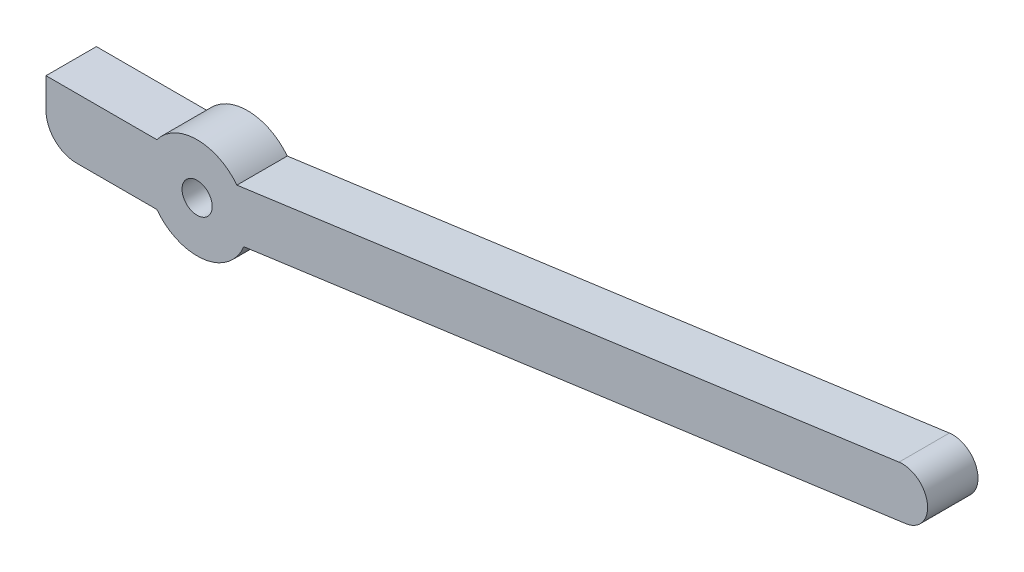
ISO-10303-21;
HEADER;
FILE_DESCRIPTION(('STEP AP214'),'2;1');
FILE_NAME('part.step','',(''),(''),'','','');
FILE_SCHEMA(('AUTOMOTIVE_DESIGN { 1 0 10303 214 1 1 1 1 }'));
ENDSEC;
DATA;
#1=APPLICATION_CONTEXT('core data for automotive mechanical design processes');
#2=APPLICATION_PROTOCOL_DEFINITION('international standard','automotive_design',2000,#1);
#3=PRODUCT_CONTEXT('',#1,'mechanical');
#4=PRODUCT('Part','Part','',(#3));
#5=PRODUCT_RELATED_PRODUCT_CATEGORY('part','',(#4));
#6=PRODUCT_DEFINITION_FORMATION('','',#4);
#7=PRODUCT_DEFINITION_CONTEXT('part definition',#1,'design');
#8=PRODUCT_DEFINITION('design','',#6,#7);
#9=PRODUCT_DEFINITION_SHAPE('','',#8);
#10=(LENGTH_UNIT() NAMED_UNIT(*) SI_UNIT(.MILLI.,.METRE.));
#11=(NAMED_UNIT(*) PLANE_ANGLE_UNIT() SI_UNIT($,.RADIAN.));
#12=(NAMED_UNIT(*) SI_UNIT($,.STERADIAN.) SOLID_ANGLE_UNIT());
#13=UNCERTAINTY_MEASURE_WITH_UNIT(LENGTH_MEASURE(1.E-05),#10,'distance_accuracy_value','');
#14=(GEOMETRIC_REPRESENTATION_CONTEXT(3) GLOBAL_UNCERTAINTY_ASSIGNED_CONTEXT((#13)) GLOBAL_UNIT_ASSIGNED_CONTEXT((#10,
#11,#12)) REPRESENTATION_CONTEXT('',''));
#15=CARTESIAN_POINT('',(0.,0.,0.));
#16=DIRECTION('',(0.,0.,1.));
#17=DIRECTION('',(1.,0.,0.));
#18=AXIS2_PLACEMENT_3D('',#15,#16,#17);
#19=CARTESIAN_POINT('',(-0.5,0.,5.));
#20=DIRECTION('',(0.,0.,-1.));
#21=DIRECTION('',(-1.,0.,0.));
#22=AXIS2_PLACEMENT_3D('',#19,#20,#21);
#23=CYLINDRICAL_SURFACE('',#22,5.);
#24=DIRECTION('',(0.,0.,1.));
#25=VECTOR('',#24,1.);
#26=CARTESIAN_POINT('',(3.4487021157377,3.06720582960593,0.));
#27=LINE('',#26,#25);
#28=CARTESIAN_POINT('',(3.4487021157377,3.06720582960593,0.));
#29=VERTEX_POINT('',#28);
#30=CARTESIAN_POINT('',(3.4487021157377,3.06720582960593,5.));
#31=VERTEX_POINT('',#30);
#32=EDGE_CURVE('E140',#29,#31,#27,.T.);
#33=ORIENTED_EDGE('',*,*,#32,.F.);
#34=CARTESIAN_POINT('',(-0.5,0.,0.));
#35=DIRECTION('',(0.,0.,1.));
#36=DIRECTION('',(1.,0.,0.));
#37=AXIS2_PLACEMENT_3D('',#34,#35,#36);
#38=CIRCLE('',#37,5.);
#39=CARTESIAN_POINT('',(-4.5,3.,0.));
#40=VERTEX_POINT('',#39);
#41=EDGE_CURVE('E161',#40,#29,#38,.F.);
#42=ORIENTED_EDGE('',*,*,#41,.F.);
#43=DIRECTION('',(0.,0.,-1.));
#44=VECTOR('',#43,1.);
#45=CARTESIAN_POINT('',(-4.5,3.,5.));
#46=LINE('',#45,#44);
#47=CARTESIAN_POINT('',(-4.5,3.,5.));
#48=VERTEX_POINT('',#47);
#49=EDGE_CURVE('E177',#48,#40,#46,.T.);
#50=ORIENTED_EDGE('',*,*,#49,.F.);
#51=CARTESIAN_POINT('',(-0.5,0.,5.));
#52=DIRECTION('',(0.,0.,1.));
#53=DIRECTION('',(1.,0.,0.));
#54=AXIS2_PLACEMENT_3D('',#51,#52,#53);
#55=CIRCLE('',#54,5.);
#56=EDGE_CURVE('E145',#48,#31,#55,.F.);
#57=ORIENTED_EDGE('',*,*,#56,.T.);
#58=EDGE_LOOP('',(#33,#42,#50,#57));
#59=FACE_BOUND('',#58,.T.);
#60=ADVANCED_FACE('F39',(#59),#23,.T.);
#61=DIRECTION('',(0.,0.,1.));
#62=VECTOR('',#61,1.);
#63=CARTESIAN_POINT('',(4.13062922494331,-1.88607342940325,0.));
#64=LINE('',#63,#62);
#65=CARTESIAN_POINT('',(4.13062922494331,-1.88607342940325,0.));
#66=VERTEX_POINT('',#65);
#67=CARTESIAN_POINT('',(4.13062922494331,-1.88607342940325,5.));
#68=VERTEX_POINT('',#67);
#69=EDGE_CURVE('E120',#66,#68,#64,.T.);
#70=ORIENTED_EDGE('',*,*,#69,.T.);
#71=CARTESIAN_POINT('',(-4.5,-3.,5.));
#72=VERTEX_POINT('',#71);
#73=EDGE_CURVE('E149',#68,#72,#55,.F.);
#74=ORIENTED_EDGE('',*,*,#73,.T.);
#75=DIRECTION('',(0.,0.,-1.));
#76=VECTOR('',#75,1.);
#77=CARTESIAN_POINT('',(-4.5,-3.,5.));
#78=LINE('',#77,#76);
#79=CARTESIAN_POINT('',(-4.5,-3.,0.));
#80=VERTEX_POINT('',#79);
#81=EDGE_CURVE('E160',#72,#80,#78,.T.);
#82=ORIENTED_EDGE('',*,*,#81,.T.);
#83=EDGE_CURVE('E142',#66,#80,#38,.F.);
#84=ORIENTED_EDGE('',*,*,#83,.F.);
#85=EDGE_LOOP('',(#70,#74,#82,#84));
#86=FACE_BOUND('',#85,.T.);
#87=ADVANCED_FACE('F200',(#86),#23,.T.);
#88=CARTESIAN_POINT('',(0.,3.,5.));
#89=DIRECTION('',(0.,1.,0.));
#90=DIRECTION('',(0.,0.,1.));
#91=AXIS2_PLACEMENT_3D('',#88,#89,#90);
#92=PLANE('',#91);
#93=DIRECTION('',(1.,0.,0.));
#94=VECTOR('',#93,1.);
#95=CARTESIAN_POINT('',(0.,3.,0.));
#96=LINE('',#95,#94);
#97=CARTESIAN_POINT('',(-15.5,3.,0.));
#98=VERTEX_POINT('',#97);
#99=EDGE_CURVE('E163',#98,#40,#96,.T.);
#100=ORIENTED_EDGE('',*,*,#99,.F.);
#101=DIRECTION('',(0.,0.,-1.));
#102=VECTOR('',#101,1.);
#103=CARTESIAN_POINT('',(-15.5,3.,5.));
#104=LINE('',#103,#102);
#105=CARTESIAN_POINT('',(-15.5,3.,5.));
#106=VERTEX_POINT('',#105);
#107=EDGE_CURVE('E175',#106,#98,#104,.T.);
#108=ORIENTED_EDGE('',*,*,#107,.F.);
#109=DIRECTION('',(1.,0.,0.));
#110=VECTOR('',#109,1.);
#111=CARTESIAN_POINT('',(0.,3.,5.));
#112=LINE('',#111,#110);
#113=EDGE_CURVE('E148',#106,#48,#112,.T.);
#114=ORIENTED_EDGE('',*,*,#113,.T.);
#115=ORIENTED_EDGE('',*,*,#49,.T.);
#116=EDGE_LOOP('',(#100,#108,#114,#115));
#117=FACE_BOUND('',#116,.T.);
#118=ADVANCED_FACE('F209',(#117),#92,.T.);
#119=CARTESIAN_POINT('',(-15.5,0.,5.));
#120=DIRECTION('',(1.,0.,0.));
#121=DIRECTION('',(0.,0.,-1.));
#122=AXIS2_PLACEMENT_3D('',#119,#120,#121);
#123=PLANE('',#122);
#124=DIRECTION('',(0.,-1.,0.));
#125=VECTOR('',#124,1.);
#126=CARTESIAN_POINT('',(-15.5,0.,0.));
#127=LINE('',#126,#125);
#128=CARTESIAN_POINT('',(-15.5,0.,0.));
#129=VERTEX_POINT('',#128);
#130=EDGE_CURVE('E166',#98,#129,#127,.T.);
#131=ORIENTED_EDGE('',*,*,#130,.T.);
#132=DIRECTION('',(0.,0.,-1.));
#133=VECTOR('',#132,1.);
#134=CARTESIAN_POINT('',(-15.5,0.,5.));
#135=LINE('',#134,#133);
#136=CARTESIAN_POINT('',(-15.5,0.,5.));
#137=VERTEX_POINT('',#136);
#138=EDGE_CURVE('E47',#129,#137,#135,.F.);
#139=ORIENTED_EDGE('',*,*,#138,.T.);
#140=DIRECTION('',(0.,-1.,0.));
#141=VECTOR('',#140,1.);
#142=CARTESIAN_POINT('',(-15.5,0.,5.));
#143=LINE('',#142,#141);
#144=EDGE_CURVE('E152',#106,#137,#143,.T.);
#145=ORIENTED_EDGE('',*,*,#144,.F.);
#146=ORIENTED_EDGE('',*,*,#107,.T.);
#147=EDGE_LOOP('',(#131,#139,#145,#146));
#148=FACE_BOUND('',#147,.T.);
#149=ADVANCED_FACE('F188',(#148),#123,.F.);
#150=CARTESIAN_POINT('',(0.,-3.,5.));
#151=DIRECTION('',(0.,-1.,0.));
#152=DIRECTION('',(1.,0.,0.));
#153=AXIS2_PLACEMENT_3D('',#150,#151,#152);
#154=PLANE('',#153);
#155=DIRECTION('',(-1.,0.,0.));
#156=VECTOR('',#155,1.);
#157=CARTESIAN_POINT('',(0.,-3.,5.));
#158=LINE('',#157,#156);
#159=CARTESIAN_POINT('',(-12.5,-3.,5.));
#160=VERTEX_POINT('',#159);
#161=EDGE_CURVE('E154',#72,#160,#158,.T.);
#162=ORIENTED_EDGE('',*,*,#161,.T.);
#163=DIRECTION('',(0.,0.,-1.));
#164=VECTOR('',#163,1.);
#165=CARTESIAN_POINT('',(-12.5,-3.,0.));
#166=LINE('',#165,#164);
#167=CARTESIAN_POINT('',(-12.5,-3.,0.));
#168=VERTEX_POINT('',#167);
#169=EDGE_CURVE('E179',#160,#168,#166,.T.);
#170=ORIENTED_EDGE('',*,*,#169,.T.);
#171=DIRECTION('',(-1.,0.,0.));
#172=VECTOR('',#171,1.);
#173=CARTESIAN_POINT('',(0.,-3.,0.));
#174=LINE('',#173,#172);
#175=EDGE_CURVE('E168',#80,#168,#174,.T.);
#176=ORIENTED_EDGE('',*,*,#175,.F.);
#177=ORIENTED_EDGE('',*,*,#81,.F.);
#178=EDGE_LOOP('',(#162,#170,#176,#177));
#179=FACE_BOUND('',#178,.T.);
#180=ADVANCED_FACE('F198',(#179),#154,.T.);
#181=CARTESIAN_POINT('',(-0.5,0.,5.));
#182=DIRECTION('',(0.,0.,-1.));
#183=DIRECTION('',(-1.,0.,0.));
#184=AXIS2_PLACEMENT_3D('',#181,#182,#183);
#185=CYLINDRICAL_SURFACE('',#184,1.5);
#186=CARTESIAN_POINT('',(-0.5,0.,5.));
#187=DIRECTION('',(0.,0.,1.));
#188=DIRECTION('',(1.,0.,0.));
#189=AXIS2_PLACEMENT_3D('',#186,#187,#188);
#190=CIRCLE('',#189,1.5);
#191=CARTESIAN_POINT('',(1.,0.,5.));
#192=VERTEX_POINT('',#191);
#193=EDGE_CURVE('E157',#192,#192,#190,.T.);
#194=ORIENTED_EDGE('',*,*,#193,.T.);
#195=EDGE_LOOP('',(#194));
#196=FACE_BOUND('',#195,.T.);
#197=CARTESIAN_POINT('',(-0.5,0.,0.));
#198=DIRECTION('',(0.,0.,1.));
#199=DIRECTION('',(1.,0.,0.));
#200=AXIS2_PLACEMENT_3D('',#197,#198,#199);
#201=CIRCLE('',#200,1.5);
#202=CARTESIAN_POINT('',(1.,0.,0.));
#203=VERTEX_POINT('',#202);
#204=EDGE_CURVE('E170',#203,#203,#201,.T.);
#205=ORIENTED_EDGE('',*,*,#204,.F.);
#206=EDGE_LOOP('',(#205));
#207=FACE_BOUND('',#206,.T.);
#208=ADVANCED_FACE('F236',(#196,#207),#185,.F.);
#209=CARTESIAN_POINT('',(0.,0.,5.));
#210=DIRECTION('',(0.,0.,1.));
#211=DIRECTION('',(1.,0.,0.));
#212=AXIS2_PLACEMENT_3D('',#209,#210,#211);
#213=PLANE('',#212);
#214=ORIENTED_EDGE('',*,*,#144,.T.);
#215=CARTESIAN_POINT('',(-12.5,0.,5.));
#216=DIRECTION('',(0.,0.,1.));
#217=DIRECTION('',(1.,0.,0.));
#218=AXIS2_PLACEMENT_3D('',#215,#216,#217);
#219=CIRCLE('',#218,3.);
#220=EDGE_CURVE('E11',#137,#160,#219,.T.);
#221=ORIENTED_EDGE('',*,*,#220,.T.);
#222=ORIENTED_EDGE('',*,*,#161,.F.);
#223=ORIENTED_EDGE('',*,*,#73,.F.);
#224=DIRECTION('',(0.990655851801835,0.136385421841122,0.));
#225=VECTOR('',#224,1.);
#226=CARTESIAN_POINT('',(4.13062922494331,-1.88607342940325,5.));
#227=LINE('',#226,#225);
#228=CARTESIAN_POINT('',(69.8409635546028,7.16038972989826,5.));
#229=VERTEX_POINT('',#228);
#230=EDGE_CURVE('E137',#68,#229,#227,.T.);
#231=ORIENTED_EDGE('',*,*,#230,.T.);
#232=CARTESIAN_POINT('',(69.5,9.63702935940285,5.));
#233=DIRECTION('',(0.,0.,1.));
#234=DIRECTION('',(1.,0.,0.));
#235=AXIS2_PLACEMENT_3D('',#232,#233,#234);
#236=CIRCLE('',#235,2.5);
#237=CARTESIAN_POINT('',(69.1590364453972,12.1136689889074,5.));
#238=VERTEX_POINT('',#237);
#239=EDGE_CURVE('E116',#229,#238,#236,.T.);
#240=ORIENTED_EDGE('',*,*,#239,.T.);
#241=DIRECTION('',(-0.990655851801835,-0.136385421841122,0.));
#242=VECTOR('',#241,1.);
#243=CARTESIAN_POINT('',(3.4487021157377,3.06720582960593,5.));
#244=LINE('',#243,#242);
#245=EDGE_CURVE('E131',#238,#31,#244,.T.);
#246=ORIENTED_EDGE('',*,*,#245,.T.);
#247=ORIENTED_EDGE('',*,*,#56,.F.);
#248=ORIENTED_EDGE('',*,*,#113,.F.);
#249=EDGE_LOOP('',(#214,#221,#222,#223,#231,#240,#246,#247,#248));
#250=FACE_BOUND('',#249,.T.);
#251=ORIENTED_EDGE('',*,*,#193,.F.);
#252=EDGE_LOOP('',(#251));
#253=FACE_BOUND('',#252,.T.);
#254=ADVANCED_FACE('F192',(#250,#253),#213,.T.);
#255=CARTESIAN_POINT('',(0.,0.,0.));
#256=DIRECTION('',(0.,0.,1.));
#257=DIRECTION('',(1.,0.,0.));
#258=AXIS2_PLACEMENT_3D('',#255,#256,#257);
#259=PLANE('',#258);
#260=ORIENTED_EDGE('',*,*,#175,.T.);
#261=CARTESIAN_POINT('',(-12.5,0.,0.));
#262=DIRECTION('',(0.,0.,1.));
#263=DIRECTION('',(1.,0.,0.));
#264=AXIS2_PLACEMENT_3D('',#261,#262,#263);
#265=CIRCLE('',#264,3.);
#266=EDGE_CURVE('E182',#168,#129,#265,.F.);
#267=ORIENTED_EDGE('',*,*,#266,.T.);
#268=ORIENTED_EDGE('',*,*,#130,.F.);
#269=ORIENTED_EDGE('',*,*,#99,.T.);
#270=ORIENTED_EDGE('',*,*,#41,.T.);
#271=DIRECTION('',(-0.990655851801835,-0.136385421841122,0.));
#272=VECTOR('',#271,1.);
#273=CARTESIAN_POINT('',(3.4487021157377,3.06720582960593,0.));
#274=LINE('',#273,#272);
#275=CARTESIAN_POINT('',(69.1590364453972,12.1136689889074,0.));
#276=VERTEX_POINT('',#275);
#277=EDGE_CURVE('E126',#276,#29,#274,.T.);
#278=ORIENTED_EDGE('',*,*,#277,.F.);
#279=CARTESIAN_POINT('',(69.5,9.63702935940285,0.));
#280=DIRECTION('',(0.,0.,1.));
#281=DIRECTION('',(1.,0.,0.));
#282=AXIS2_PLACEMENT_3D('',#279,#280,#281);
#283=CIRCLE('',#282,2.5);
#284=CARTESIAN_POINT('',(69.8409635546028,7.16038972989826,0.));
#285=VERTEX_POINT('',#284);
#286=EDGE_CURVE('E113',#285,#276,#283,.T.);
#287=ORIENTED_EDGE('',*,*,#286,.F.);
#288=DIRECTION('',(0.990655851801835,0.136385421841122,0.));
#289=VECTOR('',#288,1.);
#290=CARTESIAN_POINT('',(4.13062922494331,-1.88607342940325,0.));
#291=LINE('',#290,#289);
#292=EDGE_CURVE('E54',#66,#285,#291,.T.);
#293=ORIENTED_EDGE('',*,*,#292,.F.);
#294=ORIENTED_EDGE('',*,*,#83,.T.);
#295=EDGE_LOOP('',(#260,#267,#268,#269,#270,#278,#287,#293,#294));
#296=FACE_BOUND('',#295,.T.);
#297=ORIENTED_EDGE('',*,*,#204,.T.);
#298=EDGE_LOOP('',(#297));
#299=FACE_BOUND('',#298,.T.);
#300=ADVANCED_FACE('F123',(#296,#299),#259,.F.);
#301=CARTESIAN_POINT('',(-12.5,0.,5.));
#302=DIRECTION('',(0.,0.,1.));
#303=DIRECTION('',(1.,0.,0.));
#304=AXIS2_PLACEMENT_3D('',#301,#302,#303);
#305=CYLINDRICAL_SURFACE('',#304,3.);
#306=ORIENTED_EDGE('',*,*,#220,.F.);
#307=ORIENTED_EDGE('',*,*,#138,.F.);
#308=ORIENTED_EDGE('',*,*,#266,.F.);
#309=ORIENTED_EDGE('',*,*,#169,.F.);
#310=EDGE_LOOP('',(#306,#307,#308,#309));
#311=FACE_BOUND('',#310,.T.);
#312=ADVANCED_FACE('F41',(#311),#305,.T.);
#313=CARTESIAN_POINT('',(3.4487021157377,3.06720582960593,0.));
#314=DIRECTION('',(-0.136385421841122,0.990655851801835,0.));
#315=DIRECTION('',(-0.990655851801835,-0.136385421841122,0.));
#316=AXIS2_PLACEMENT_3D('',#313,#314,#315);
#317=PLANE('',#316);
#318=ORIENTED_EDGE('',*,*,#245,.F.);
#319=DIRECTION('',(0.,0.,1.));
#320=VECTOR('',#319,1.);
#321=CARTESIAN_POINT('',(69.1590364453972,12.1136689889074,0.));
#322=LINE('',#321,#320);
#323=EDGE_CURVE('E119',#276,#238,#322,.T.);
#324=ORIENTED_EDGE('',*,*,#323,.F.);
#325=ORIENTED_EDGE('',*,*,#277,.T.);
#326=ORIENTED_EDGE('',*,*,#32,.T.);
#327=EDGE_LOOP('',(#318,#324,#325,#326));
#328=FACE_BOUND('',#327,.T.);
#329=ADVANCED_FACE('F204',(#328),#317,.T.);
#330=CARTESIAN_POINT('',(69.5,9.63702935940285,0.));
#331=DIRECTION('',(0.,0.,1.));
#332=DIRECTION('',(1.,0.,0.));
#333=AXIS2_PLACEMENT_3D('',#330,#331,#332);
#334=CYLINDRICAL_SURFACE('',#333,2.5);
#335=ORIENTED_EDGE('',*,*,#239,.F.);
#336=DIRECTION('',(0.,0.,1.));
#337=VECTOR('',#336,1.);
#338=CARTESIAN_POINT('',(69.8409635546028,7.16038972989826,0.));
#339=LINE('',#338,#337);
#340=EDGE_CURVE('E111',#285,#229,#339,.T.);
#341=ORIENTED_EDGE('',*,*,#340,.F.);
#342=ORIENTED_EDGE('',*,*,#286,.T.);
#343=ORIENTED_EDGE('',*,*,#323,.T.);
#344=EDGE_LOOP('',(#335,#341,#342,#343));
#345=FACE_BOUND('',#344,.T.);
#346=ADVANCED_FACE('F112',(#345),#334,.T.);
#347=CARTESIAN_POINT('',(4.13062922494331,-1.88607342940325,0.));
#348=DIRECTION('',(0.136385421841122,-0.990655851801835,0.));
#349=DIRECTION('',(0.990655851801835,0.136385421841122,0.));
#350=AXIS2_PLACEMENT_3D('',#347,#348,#349);
#351=PLANE('',#350);
#352=ORIENTED_EDGE('',*,*,#230,.F.);
#353=ORIENTED_EDGE('',*,*,#69,.F.);
#354=ORIENTED_EDGE('',*,*,#292,.T.);
#355=ORIENTED_EDGE('',*,*,#340,.T.);
#356=EDGE_LOOP('',(#352,#353,#354,#355));
#357=FACE_BOUND('',#356,.T.);
#358=ADVANCED_FACE('F128',(#357),#351,.T.);
#359=CLOSED_SHELL('',(#60,#87,#118,#149,#180,#208,#254,#300,#312,#329,#346,#358));
#360=MANIFOLD_SOLID_BREP('B2',#359);
#361=ADVANCED_BREP_SHAPE_REPRESENTATION('',(#18,#360),#14);
#362=SHAPE_DEFINITION_REPRESENTATION(#9,#361);
ENDSEC;
END-ISO-10303-21;
